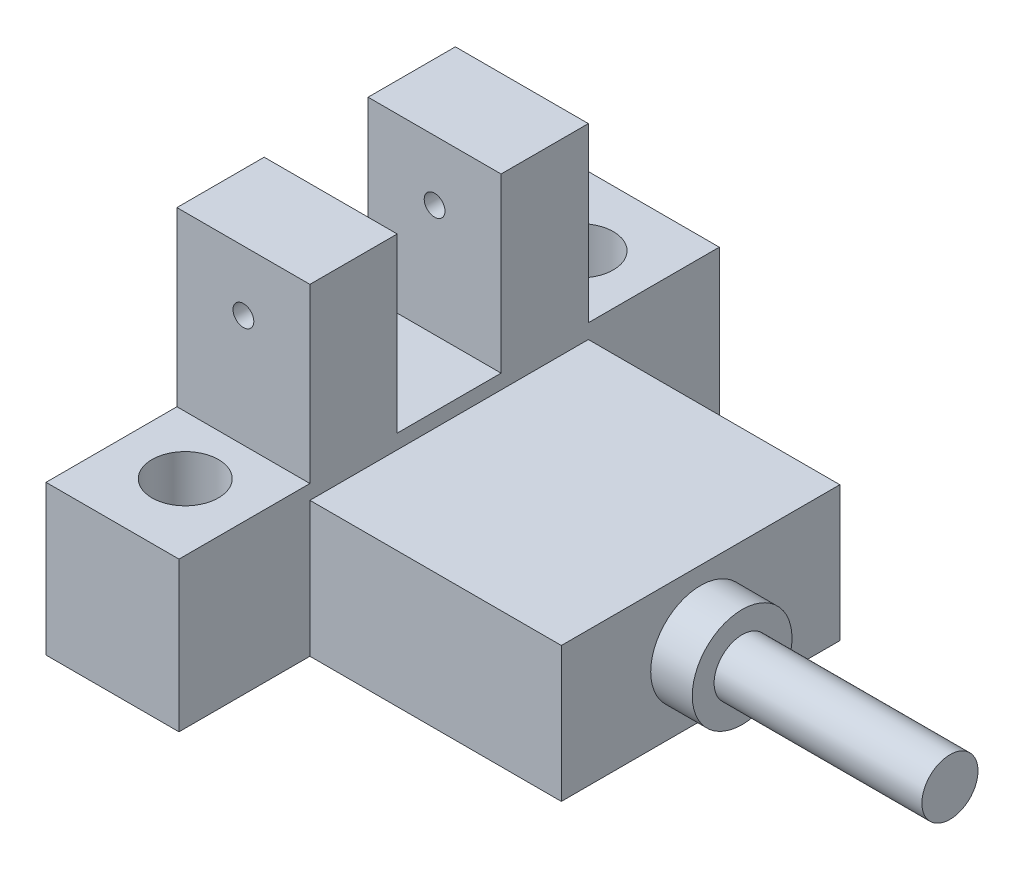
ISO-10303-21;
HEADER;
FILE_DESCRIPTION(('STEP AP214'),'2;1');
FILE_NAME('part.step','',(''),(''),'','','');
FILE_SCHEMA(('AUTOMOTIVE_DESIGN { 1 0 10303 214 1 1 1 1 }'));
ENDSEC;
DATA;
#1=APPLICATION_CONTEXT('core data for automotive mechanical design processes');
#2=APPLICATION_PROTOCOL_DEFINITION('international standard','automotive_design',2000,#1);
#3=PRODUCT_CONTEXT('',#1,'mechanical');
#4=PRODUCT('Part','Part','',(#3));
#5=PRODUCT_RELATED_PRODUCT_CATEGORY('part','',(#4));
#6=PRODUCT_DEFINITION_FORMATION('','',#4);
#7=PRODUCT_DEFINITION_CONTEXT('part definition',#1,'design');
#8=PRODUCT_DEFINITION('design','',#6,#7);
#9=PRODUCT_DEFINITION_SHAPE('','',#8);
#10=(LENGTH_UNIT() NAMED_UNIT(*) SI_UNIT(.MILLI.,.METRE.));
#11=(NAMED_UNIT(*) PLANE_ANGLE_UNIT() SI_UNIT($,.RADIAN.));
#12=(NAMED_UNIT(*) SI_UNIT($,.STERADIAN.) SOLID_ANGLE_UNIT());
#13=UNCERTAINTY_MEASURE_WITH_UNIT(LENGTH_MEASURE(1.E-05),#10,'distance_accuracy_value','');
#14=(GEOMETRIC_REPRESENTATION_CONTEXT(3) GLOBAL_UNCERTAINTY_ASSIGNED_CONTEXT((#13)) GLOBAL_UNIT_ASSIGNED_CONTEXT((#10,
#11,#12)) REPRESENTATION_CONTEXT('',''));
#15=CARTESIAN_POINT('',(0.,0.,0.));
#16=DIRECTION('',(0.,0.,1.));
#17=DIRECTION('',(1.,0.,0.));
#18=AXIS2_PLACEMENT_3D('',#15,#16,#17);
#19=CARTESIAN_POINT('',(20.5,3.24999999999999,13.));
#20=DIRECTION('',(1.,0.,0.));
#21=DIRECTION('',(0.,0.,-1.));
#22=AXIS2_PLACEMENT_3D('',#19,#20,#21);
#23=PLANE('',#22);
#24=CARTESIAN_POINT('',(20.5,3.24999999999999,13.));
#25=DIRECTION('',(1.,0.,0.));
#26=DIRECTION('',(0.,0.,-1.));
#27=AXIS2_PLACEMENT_3D('',#24,#25,#26);
#28=CIRCLE('',#27,2.4);
#29=CARTESIAN_POINT('',(20.5,3.24999999999999,10.6));
#30=VERTEX_POINT('',#29);
#31=EDGE_CURVE('E585',#30,#30,#28,.T.);
#32=ORIENTED_EDGE('',*,*,#31,.T.);
#33=EDGE_LOOP('',(#32));
#34=FACE_BOUND('',#33,.T.);
#35=CARTESIAN_POINT('',(20.5,3.24999999999999,13.));
#36=DIRECTION('',(1.,0.,0.));
#37=DIRECTION('',(0.,0.,-1.));
#38=AXIS2_PLACEMENT_3D('',#35,#36,#37);
#39=CIRCLE('',#38,1.35);
#40=CARTESIAN_POINT('',(20.5,3.24999999999999,11.65));
#41=VERTEX_POINT('',#40);
#42=EDGE_CURVE('E586',#41,#41,#39,.T.);
#43=ORIENTED_EDGE('',*,*,#42,.F.);
#44=EDGE_LOOP('',(#43));
#45=FACE_BOUND('',#44,.T.);
#46=ADVANCED_FACE('F38',(#34,#45),#23,.T.);
#47=CARTESIAN_POINT('',(18.5,6.5,26.));
#48=DIRECTION('',(-1.,0.,0.));
#49=DIRECTION('',(0.,0.,1.));
#50=AXIS2_PLACEMENT_3D('',#47,#48,#49);
#51=PLANE('',#50);
#52=DIRECTION('',(0.,0.,-1.));
#53=VECTOR('',#52,1.);
#54=CARTESIAN_POINT('',(18.5,0.,26.));
#55=LINE('',#54,#53);
#56=CARTESIAN_POINT('',(18.5,0.,19.7));
#57=VERTEX_POINT('',#56);
#58=CARTESIAN_POINT('',(18.5,0.,6.3));
#59=VERTEX_POINT('',#58);
#60=EDGE_CURVE('E46',#57,#59,#55,.T.);
#61=ORIENTED_EDGE('',*,*,#60,.T.);
#62=DIRECTION('',(0.,1.,0.));
#63=VECTOR('',#62,1.);
#64=CARTESIAN_POINT('',(18.5,-19.5,6.3));
#65=LINE('',#64,#63);
#66=CARTESIAN_POINT('',(18.5,6.5,6.3));
#67=VERTEX_POINT('',#66);
#68=EDGE_CURVE('E235',#59,#67,#65,.T.);
#69=ORIENTED_EDGE('',*,*,#68,.T.);
#70=DIRECTION('',(0.,0.,-1.));
#71=VECTOR('',#70,1.);
#72=CARTESIAN_POINT('',(18.5,6.5,26.));
#73=LINE('',#72,#71);
#74=CARTESIAN_POINT('',(18.5,6.5,19.7));
#75=VERTEX_POINT('',#74);
#76=EDGE_CURVE('E295',#75,#67,#73,.T.);
#77=ORIENTED_EDGE('',*,*,#76,.F.);
#78=DIRECTION('',(0.,1.,0.));
#79=VECTOR('',#78,1.);
#80=CARTESIAN_POINT('',(18.5,-19.5,19.7));
#81=LINE('',#80,#79);
#82=EDGE_CURVE('E251',#57,#75,#81,.T.);
#83=ORIENTED_EDGE('',*,*,#82,.F.);
#84=EDGE_LOOP('',(#61,#69,#77,#83));
#85=FACE_BOUND('',#84,.T.);
#86=CARTESIAN_POINT('',(18.5,3.24999999999999,13.));
#87=DIRECTION('',(-1.,0.,0.));
#88=DIRECTION('',(0.,0.,1.));
#89=AXIS2_PLACEMENT_3D('',#86,#87,#88);
#90=CIRCLE('',#89,2.4);
#91=CARTESIAN_POINT('',(18.5,3.24999999999999,15.4));
#92=VERTEX_POINT('',#91);
#93=EDGE_CURVE('E11',#92,#92,#90,.F.);
#94=ORIENTED_EDGE('',*,*,#93,.F.);
#95=EDGE_LOOP('',(#94));
#96=FACE_BOUND('',#95,.T.);
#97=ADVANCED_FACE('F341',(#85,#96),#51,.F.);
#98=CARTESIAN_POINT('',(0.,15.5,26.));
#99=DIRECTION('',(0.,-1.,0.));
#100=DIRECTION('',(0.,0.,-1.));
#101=AXIS2_PLACEMENT_3D('',#98,#99,#100);
#102=PLANE('',#101);
#103=DIRECTION('',(0.,0.,-1.));
#104=VECTOR('',#103,1.);
#105=CARTESIAN_POINT('',(6.4,15.5,26.));
#106=LINE('',#105,#104);
#107=CARTESIAN_POINT('',(6.4,15.5,19.7));
#108=VERTEX_POINT('',#107);
#109=CARTESIAN_POINT('',(6.4,15.5,15.5));
#110=VERTEX_POINT('',#109);
#111=EDGE_CURVE('E289',#108,#110,#106,.T.);
#112=ORIENTED_EDGE('',*,*,#111,.T.);
#113=DIRECTION('',(1.,0.,0.));
#114=VECTOR('',#113,1.);
#115=CARTESIAN_POINT('',(0.,15.5,15.5));
#116=LINE('',#115,#114);
#117=CARTESIAN_POINT('',(0.,15.5,15.5));
#118=VERTEX_POINT('',#117);
#119=EDGE_CURVE('E164',#118,#110,#116,.T.);
#120=ORIENTED_EDGE('',*,*,#119,.F.);
#121=DIRECTION('',(0.,0.,-1.));
#122=VECTOR('',#121,1.);
#123=CARTESIAN_POINT('',(0.,15.5,26.));
#124=LINE('',#123,#122);
#125=CARTESIAN_POINT('',(0.,15.5,19.7));
#126=VERTEX_POINT('',#125);
#127=EDGE_CURVE('E285',#126,#118,#124,.T.);
#128=ORIENTED_EDGE('',*,*,#127,.F.);
#129=DIRECTION('',(-1.,0.,0.));
#130=VECTOR('',#129,1.);
#131=CARTESIAN_POINT('',(0.,15.5,19.7));
#132=LINE('',#131,#130);
#133=EDGE_CURVE('E213',#108,#126,#132,.T.);
#134=ORIENTED_EDGE('',*,*,#133,.F.);
#135=EDGE_LOOP('',(#112,#120,#128,#134));
#136=FACE_BOUND('',#135,.T.);
#137=ADVANCED_FACE('F347',(#136),#102,.F.);
#138=CARTESIAN_POINT('',(0.,0.,0.));
#139=DIRECTION('',(0.,0.,-1.));
#140=DIRECTION('',(-1.,0.,0.));
#141=AXIS2_PLACEMENT_3D('',#138,#139,#140);
#142=PLANE('',#141);
#143=DIRECTION('',(0.,-1.,0.));
#144=VECTOR('',#143,1.);
#145=CARTESIAN_POINT('',(0.,0.,0.));
#146=LINE('',#145,#144);
#147=CARTESIAN_POINT('',(0.,7.2,0.));
#148=VERTEX_POINT('',#147);
#149=CARTESIAN_POINT('',(0.,0.,0.));
#150=VERTEX_POINT('',#149);
#151=EDGE_CURVE('E266',#148,#150,#146,.T.);
#152=ORIENTED_EDGE('',*,*,#151,.F.);
#153=DIRECTION('',(-1.,0.,0.));
#154=VECTOR('',#153,1.);
#155=CARTESIAN_POINT('',(0.,7.2,0.));
#156=LINE('',#155,#154);
#157=CARTESIAN_POINT('',(6.4,7.2,0.));
#158=VERTEX_POINT('',#157);
#159=EDGE_CURVE('E203',#158,#148,#156,.T.);
#160=ORIENTED_EDGE('',*,*,#159,.F.);
#161=DIRECTION('',(0.,1.,0.));
#162=VECTOR('',#161,1.);
#163=CARTESIAN_POINT('',(6.4,15.5,0.));
#164=LINE('',#163,#162);
#165=CARTESIAN_POINT('',(6.4,0.,0.));
#166=VERTEX_POINT('',#165);
#167=EDGE_CURVE('E275',#166,#158,#164,.T.);
#168=ORIENTED_EDGE('',*,*,#167,.F.);
#169=DIRECTION('',(1.,0.,0.));
#170=VECTOR('',#169,1.);
#171=CARTESIAN_POINT('',(18.5,0.,0.));
#172=LINE('',#171,#170);
#173=EDGE_CURVE('E261',#150,#166,#172,.T.);
#174=ORIENTED_EDGE('',*,*,#173,.F.);
#175=EDGE_LOOP('',(#152,#160,#168,#174));
#176=FACE_BOUND('',#175,.T.);
#177=ADVANCED_FACE('F374',(#176),#142,.T.);
#178=CARTESIAN_POINT('',(18.5,0.,26.));
#179=DIRECTION('',(0.,1.,0.));
#180=DIRECTION('',(-1.,0.,0.));
#181=AXIS2_PLACEMENT_3D('',#178,#179,#180);
#182=PLANE('',#181);
#183=CARTESIAN_POINT('',(3.2,0.,3.5));
#184=DIRECTION('',(0.,1.,0.));
#185=DIRECTION('',(-1.,0.,0.));
#186=AXIS2_PLACEMENT_3D('',#183,#184,#185);
#187=CIRCLE('',#186,1.6);
#188=CARTESIAN_POINT('',(3.2,0.,5.1));
#189=VERTEX_POINT('',#188);
#190=EDGE_CURVE('E596',#189,#189,#187,.T.);
#191=ORIENTED_EDGE('',*,*,#190,.T.);
#192=EDGE_LOOP('',(#191));
#193=FACE_BOUND('',#192,.T.);
#194=CARTESIAN_POINT('',(3.2,0.,22.5));
#195=DIRECTION('',(0.,1.,0.));
#196=DIRECTION('',(-1.,0.,0.));
#197=AXIS2_PLACEMENT_3D('',#194,#195,#196);
#198=CIRCLE('',#197,1.6);
#199=CARTESIAN_POINT('',(3.2,0.,24.1));
#200=VERTEX_POINT('',#199);
#201=EDGE_CURVE('E310',#200,#200,#198,.T.);
#202=ORIENTED_EDGE('',*,*,#201,.T.);
#203=EDGE_LOOP('',(#202));
#204=FACE_BOUND('',#203,.T.);
#205=ORIENTED_EDGE('',*,*,#173,.T.);
#206=DIRECTION('',(0.,0.,1.));
#207=VECTOR('',#206,1.);
#208=CARTESIAN_POINT('',(6.4,0.,26.));
#209=LINE('',#208,#207);
#210=CARTESIAN_POINT('',(6.4,0.,6.3));
#211=VERTEX_POINT('',#210);
#212=EDGE_CURVE('E239',#166,#211,#209,.T.);
#213=ORIENTED_EDGE('',*,*,#212,.T.);
#214=DIRECTION('',(1.,0.,0.));
#215=VECTOR('',#214,1.);
#216=CARTESIAN_POINT('',(18.5,0.,6.3));
#217=LINE('',#216,#215);
#218=EDGE_CURVE('E245',#211,#59,#217,.T.);
#219=ORIENTED_EDGE('',*,*,#218,.T.);
#220=ORIENTED_EDGE('',*,*,#60,.F.);
#221=DIRECTION('',(-1.,0.,0.));
#222=VECTOR('',#221,1.);
#223=CARTESIAN_POINT('',(18.5,0.,19.7));
#224=LINE('',#223,#222);
#225=CARTESIAN_POINT('',(6.4,0.,19.7));
#226=VERTEX_POINT('',#225);
#227=EDGE_CURVE('E258',#57,#226,#224,.T.);
#228=ORIENTED_EDGE('',*,*,#227,.T.);
#229=DIRECTION('',(0.,0.,1.));
#230=VECTOR('',#229,1.);
#231=CARTESIAN_POINT('',(6.4,0.,26.));
#232=LINE('',#231,#230);
#233=CARTESIAN_POINT('',(6.4,0.,26.));
#234=VERTEX_POINT('',#233);
#235=EDGE_CURVE('E254',#226,#234,#232,.T.);
#236=ORIENTED_EDGE('',*,*,#235,.T.);
#237=DIRECTION('',(1.,0.,0.));
#238=VECTOR('',#237,1.);
#239=CARTESIAN_POINT('',(18.5,0.,26.));
#240=LINE('',#239,#238);
#241=CARTESIAN_POINT('',(0.,0.,26.));
#242=VERTEX_POINT('',#241);
#243=EDGE_CURVE('E262',#242,#234,#240,.T.);
#244=ORIENTED_EDGE('',*,*,#243,.F.);
#245=DIRECTION('',(0.,0.,-1.));
#246=VECTOR('',#245,1.);
#247=CARTESIAN_POINT('',(0.,0.,26.));
#248=LINE('',#247,#246);
#249=EDGE_CURVE('E271',#242,#150,#248,.T.);
#250=ORIENTED_EDGE('',*,*,#249,.T.);
#251=EDGE_LOOP('',(#205,#213,#219,#220,#228,#236,#244,#250));
#252=FACE_BOUND('',#251,.T.);
#253=ADVANCED_FACE('F40',(#193,#204,#252),#182,.F.);
#254=CARTESIAN_POINT('',(6.4,6.5,26.));
#255=DIRECTION('',(0.,-1.,0.));
#256=DIRECTION('',(1.,0.,0.));
#257=AXIS2_PLACEMENT_3D('',#254,#255,#256);
#258=PLANE('',#257);
#259=ORIENTED_EDGE('',*,*,#76,.T.);
#260=DIRECTION('',(1.,0.,0.));
#261=VECTOR('',#260,1.);
#262=CARTESIAN_POINT('',(6.4,6.5,6.3));
#263=LINE('',#262,#261);
#264=CARTESIAN_POINT('',(6.4,6.5,6.3));
#265=VERTEX_POINT('',#264);
#266=EDGE_CURVE('E230',#265,#67,#263,.T.);
#267=ORIENTED_EDGE('',*,*,#266,.F.);
#268=DIRECTION('',(0.,0.,-1.));
#269=VECTOR('',#268,1.);
#270=CARTESIAN_POINT('',(6.4,6.5,26.));
#271=LINE('',#270,#269);
#272=CARTESIAN_POINT('',(6.4,6.5,19.7));
#273=VERTEX_POINT('',#272);
#274=EDGE_CURVE('E291',#273,#265,#271,.T.);
#275=ORIENTED_EDGE('',*,*,#274,.F.);
#276=DIRECTION('',(-1.,0.,0.));
#277=VECTOR('',#276,1.);
#278=CARTESIAN_POINT('',(6.4,6.5,19.7));
#279=LINE('',#278,#277);
#280=EDGE_CURVE('E248',#75,#273,#279,.T.);
#281=ORIENTED_EDGE('',*,*,#280,.F.);
#282=EDGE_LOOP('',(#259,#267,#275,#281));
#283=FACE_BOUND('',#282,.T.);
#284=ADVANCED_FACE('F373',(#283),#258,.F.);
#285=CARTESIAN_POINT('',(6.4,15.5,26.));
#286=DIRECTION('',(-1.,0.,0.));
#287=DIRECTION('',(0.,-1.,0.));
#288=AXIS2_PLACEMENT_3D('',#285,#286,#287);
#289=PLANE('',#288);
#290=DIRECTION('',(0.,0.,-1.));
#291=VECTOR('',#290,1.);
#292=CARTESIAN_POINT('',(6.4,7.2,10.5));
#293=LINE('',#292,#291);
#294=CARTESIAN_POINT('',(6.4,7.2,15.5));
#295=VERTEX_POINT('',#294);
#296=CARTESIAN_POINT('',(6.4,7.2,10.5));
#297=VERTEX_POINT('',#296);
#298=EDGE_CURVE('E169',#295,#297,#293,.T.);
#299=ORIENTED_EDGE('',*,*,#298,.F.);
#300=DIRECTION('',(0.,1.,0.));
#301=VECTOR('',#300,1.);
#302=CARTESIAN_POINT('',(6.4,-0.921576201698783,15.5));
#303=LINE('',#302,#301);
#304=EDGE_CURVE('E158',#295,#110,#303,.T.);
#305=ORIENTED_EDGE('',*,*,#304,.T.);
#306=ORIENTED_EDGE('',*,*,#111,.F.);
#307=DIRECTION('',(0.,1.,0.));
#308=VECTOR('',#307,1.);
#309=CARTESIAN_POINT('',(6.4,7.2,19.7));
#310=LINE('',#309,#308);
#311=CARTESIAN_POINT('',(6.4,7.2,19.7));
#312=VERTEX_POINT('',#311);
#313=EDGE_CURVE('E225',#312,#108,#310,.T.);
#314=ORIENTED_EDGE('',*,*,#313,.F.);
#315=DIRECTION('',(0.,0.,-1.));
#316=VECTOR('',#315,1.);
#317=CARTESIAN_POINT('',(6.4,7.2,26.));
#318=LINE('',#317,#316);
#319=CARTESIAN_POINT('',(6.4,7.2,26.));
#320=VERTEX_POINT('',#319);
#321=EDGE_CURVE('E220',#320,#312,#318,.T.);
#322=ORIENTED_EDGE('',*,*,#321,.F.);
#323=DIRECTION('',(0.,1.,0.));
#324=VECTOR('',#323,1.);
#325=CARTESIAN_POINT('',(6.4,15.5,26.));
#326=LINE('',#325,#324);
#327=EDGE_CURVE('E265',#234,#320,#326,.T.);
#328=ORIENTED_EDGE('',*,*,#327,.F.);
#329=ORIENTED_EDGE('',*,*,#235,.F.);
#330=DIRECTION('',(0.,1.,0.));
#331=VECTOR('',#330,1.);
#332=CARTESIAN_POINT('',(6.4,-19.5,19.7));
#333=LINE('',#332,#331);
#334=EDGE_CURVE('E252',#226,#273,#333,.T.);
#335=ORIENTED_EDGE('',*,*,#334,.T.);
#336=ORIENTED_EDGE('',*,*,#274,.T.);
#337=DIRECTION('',(0.,1.,0.));
#338=VECTOR('',#337,1.);
#339=CARTESIAN_POINT('',(6.4,-19.5,6.3));
#340=LINE('',#339,#338);
#341=EDGE_CURVE('E234',#211,#265,#340,.T.);
#342=ORIENTED_EDGE('',*,*,#341,.F.);
#343=ORIENTED_EDGE('',*,*,#212,.F.);
#344=ORIENTED_EDGE('',*,*,#167,.T.);
#345=DIRECTION('',(0.,0.,-1.));
#346=VECTOR('',#345,1.);
#347=CARTESIAN_POINT('',(6.4,7.2,0.));
#348=LINE('',#347,#346);
#349=CARTESIAN_POINT('',(6.4,7.2,6.3));
#350=VERTEX_POINT('',#349);
#351=EDGE_CURVE('E64',#350,#158,#348,.T.);
#352=ORIENTED_EDGE('',*,*,#351,.F.);
#353=DIRECTION('',(0.,1.,0.));
#354=VECTOR('',#353,1.);
#355=CARTESIAN_POINT('',(6.4,7.2,6.3));
#356=LINE('',#355,#354);
#357=CARTESIAN_POINT('',(6.4,15.5,6.3));
#358=VERTEX_POINT('',#357);
#359=EDGE_CURVE('E209',#350,#358,#356,.T.);
#360=ORIENTED_EDGE('',*,*,#359,.T.);
#361=CARTESIAN_POINT('',(6.4,15.5,10.5));
#362=VERTEX_POINT('',#361);
#363=EDGE_CURVE('E288',#362,#358,#106,.T.);
#364=ORIENTED_EDGE('',*,*,#363,.F.);
#365=DIRECTION('',(0.,1.,0.));
#366=VECTOR('',#365,1.);
#367=CARTESIAN_POINT('',(6.4,-0.921576201698783,10.5));
#368=LINE('',#367,#366);
#369=EDGE_CURVE('E182',#297,#362,#368,.T.);
#370=ORIENTED_EDGE('',*,*,#369,.F.);
#371=EDGE_LOOP('',(#299,#305,#306,#314,#322,#328,#329,#335,#336,#342,#343,#344,#352,#360,#364,#370));
#372=FACE_BOUND('',#371,.T.);
#373=ADVANCED_FACE('F180',(#372),#289,.F.);
#374=CARTESIAN_POINT('',(0.,15.5,10.5));
#375=VERTEX_POINT('',#374);
#376=CARTESIAN_POINT('',(0.,15.5,6.3));
#377=VERTEX_POINT('',#376);
#378=EDGE_CURVE('E284',#375,#377,#124,.T.);
#379=ORIENTED_EDGE('',*,*,#378,.F.);
#380=DIRECTION('',(-1.,0.,0.));
#381=VECTOR('',#380,1.);
#382=CARTESIAN_POINT('',(0.,15.5,10.5));
#383=LINE('',#382,#381);
#384=EDGE_CURVE('E53',#362,#375,#383,.T.);
#385=ORIENTED_EDGE('',*,*,#384,.F.);
#386=ORIENTED_EDGE('',*,*,#363,.T.);
#387=DIRECTION('',(1.,0.,0.));
#388=VECTOR('',#387,1.);
#389=CARTESIAN_POINT('',(0.,15.5,6.3));
#390=LINE('',#389,#388);
#391=EDGE_CURVE('E193',#377,#358,#390,.T.);
#392=ORIENTED_EDGE('',*,*,#391,.F.);
#393=EDGE_LOOP('',(#379,#385,#386,#392));
#394=FACE_BOUND('',#393,.T.);
#395=ADVANCED_FACE('F411',(#394),#102,.F.);
#396=CARTESIAN_POINT('',(0.,0.,26.));
#397=DIRECTION('',(1.,0.,0.));
#398=DIRECTION('',(0.,0.,-1.));
#399=AXIS2_PLACEMENT_3D('',#396,#397,#398);
#400=PLANE('',#399);
#401=ORIENTED_EDGE('',*,*,#127,.T.);
#402=DIRECTION('',(0.,1.,0.));
#403=VECTOR('',#402,1.);
#404=CARTESIAN_POINT('',(0.,-0.921576201698783,15.5));
#405=LINE('',#404,#403);
#406=CARTESIAN_POINT('',(0.,7.2,15.5));
#407=VERTEX_POINT('',#406);
#408=EDGE_CURVE('E191',#407,#118,#405,.T.);
#409=ORIENTED_EDGE('',*,*,#408,.F.);
#410=DIRECTION('',(0.,0.,1.));
#411=VECTOR('',#410,1.);
#412=CARTESIAN_POINT('',(0.,7.2,10.5));
#413=LINE('',#412,#411);
#414=CARTESIAN_POINT('',(0.,7.2,10.5));
#415=VERTEX_POINT('',#414);
#416=EDGE_CURVE('E177',#415,#407,#413,.T.);
#417=ORIENTED_EDGE('',*,*,#416,.F.);
#418=DIRECTION('',(0.,1.,0.));
#419=VECTOR('',#418,1.);
#420=CARTESIAN_POINT('',(0.,-0.921576201698783,10.5));
#421=LINE('',#420,#419);
#422=EDGE_CURVE('E189',#415,#375,#421,.T.);
#423=ORIENTED_EDGE('',*,*,#422,.T.);
#424=ORIENTED_EDGE('',*,*,#378,.T.);
#425=DIRECTION('',(0.,1.,0.));
#426=VECTOR('',#425,1.);
#427=CARTESIAN_POINT('',(0.,7.2,6.3));
#428=LINE('',#427,#426);
#429=CARTESIAN_POINT('',(0.,7.2,6.3));
#430=VERTEX_POINT('',#429);
#431=EDGE_CURVE('E206',#430,#377,#428,.T.);
#432=ORIENTED_EDGE('',*,*,#431,.F.);
#433=DIRECTION('',(0.,0.,1.));
#434=VECTOR('',#433,1.);
#435=CARTESIAN_POINT('',(0.,7.2,0.));
#436=LINE('',#435,#434);
#437=EDGE_CURVE('E194',#148,#430,#436,.T.);
#438=ORIENTED_EDGE('',*,*,#437,.F.);
#439=ORIENTED_EDGE('',*,*,#151,.T.);
#440=ORIENTED_EDGE('',*,*,#249,.F.);
#441=DIRECTION('',(0.,-1.,0.));
#442=VECTOR('',#441,1.);
#443=CARTESIAN_POINT('',(0.,0.,26.));
#444=LINE('',#443,#442);
#445=CARTESIAN_POINT('',(0.,7.2,26.));
#446=VERTEX_POINT('',#445);
#447=EDGE_CURVE('E269',#446,#242,#444,.T.);
#448=ORIENTED_EDGE('',*,*,#447,.F.);
#449=DIRECTION('',(0.,0.,1.));
#450=VECTOR('',#449,1.);
#451=CARTESIAN_POINT('',(0.,7.2,26.));
#452=LINE('',#451,#450);
#453=CARTESIAN_POINT('',(0.,7.2,19.7));
#454=VERTEX_POINT('',#453);
#455=EDGE_CURVE('E216',#454,#446,#452,.T.);
#456=ORIENTED_EDGE('',*,*,#455,.F.);
#457=DIRECTION('',(0.,1.,0.));
#458=VECTOR('',#457,1.);
#459=CARTESIAN_POINT('',(0.,7.2,19.7));
#460=LINE('',#459,#458);
#461=EDGE_CURVE('E227',#454,#126,#460,.T.);
#462=ORIENTED_EDGE('',*,*,#461,.T.);
#463=EDGE_LOOP('',(#401,#409,#417,#423,#424,#432,#438,#439,#440,#448,#456,#462));
#464=FACE_BOUND('',#463,.T.);
#465=ADVANCED_FACE('F404',(#464),#400,.F.);
#466=CARTESIAN_POINT('',(0.,0.,26.));
#467=DIRECTION('',(0.,0.,-1.));
#468=DIRECTION('',(-1.,0.,0.));
#469=AXIS2_PLACEMENT_3D('',#466,#467,#468);
#470=PLANE('',#469);
#471=ORIENTED_EDGE('',*,*,#327,.T.);
#472=DIRECTION('',(1.,0.,0.));
#473=VECTOR('',#472,1.);
#474=CARTESIAN_POINT('',(0.,7.2,26.));
#475=LINE('',#474,#473);
#476=EDGE_CURVE('E218',#446,#320,#475,.T.);
#477=ORIENTED_EDGE('',*,*,#476,.F.);
#478=ORIENTED_EDGE('',*,*,#447,.T.);
#479=ORIENTED_EDGE('',*,*,#243,.T.);
#480=EDGE_LOOP('',(#471,#477,#478,#479));
#481=FACE_BOUND('',#480,.T.);
#482=ADVANCED_FACE('F400',(#481),#470,.F.);
#483=CARTESIAN_POINT('',(6.4,-19.5,19.7));
#484=DIRECTION('',(0.,0.,-1.));
#485=DIRECTION('',(-1.,0.,0.));
#486=AXIS2_PLACEMENT_3D('',#483,#484,#485);
#487=PLANE('',#486);
#488=ORIENTED_EDGE('',*,*,#82,.T.);
#489=ORIENTED_EDGE('',*,*,#280,.T.);
#490=ORIENTED_EDGE('',*,*,#334,.F.);
#491=ORIENTED_EDGE('',*,*,#227,.F.);
#492=EDGE_LOOP('',(#488,#489,#490,#491));
#493=FACE_BOUND('',#492,.T.);
#494=ADVANCED_FACE('F395',(#493),#487,.F.);
#495=CARTESIAN_POINT('',(6.4,-19.5,6.3));
#496=DIRECTION('',(0.,0.,1.));
#497=DIRECTION('',(1.,0.,0.));
#498=AXIS2_PLACEMENT_3D('',#495,#496,#497);
#499=PLANE('',#498);
#500=ORIENTED_EDGE('',*,*,#341,.T.);
#501=ORIENTED_EDGE('',*,*,#266,.T.);
#502=ORIENTED_EDGE('',*,*,#68,.F.);
#503=ORIENTED_EDGE('',*,*,#218,.F.);
#504=EDGE_LOOP('',(#500,#501,#502,#503));
#505=FACE_BOUND('',#504,.T.);
#506=ADVANCED_FACE('F386',(#505),#499,.F.);
#507=CARTESIAN_POINT('',(0.,7.2,19.7));
#508=DIRECTION('',(0.,0.,-1.));
#509=DIRECTION('',(-1.,0.,0.));
#510=AXIS2_PLACEMENT_3D('',#507,#508,#509);
#511=PLANE('',#510);
#512=CARTESIAN_POINT('',(3.2,12.6,19.7));
#513=DIRECTION('',(0.,0.,1.));
#514=DIRECTION('',(1.,0.,0.));
#515=AXIS2_PLACEMENT_3D('',#512,#513,#514);
#516=CIRCLE('',#515,0.5);
#517=CARTESIAN_POINT('',(3.7,12.6,19.7));
#518=VERTEX_POINT('',#517);
#519=EDGE_CURVE('E303',#518,#518,#516,.T.);
#520=ORIENTED_EDGE('',*,*,#519,.F.);
#521=EDGE_LOOP('',(#520));
#522=FACE_BOUND('',#521,.T.);
#523=ORIENTED_EDGE('',*,*,#133,.T.);
#524=ORIENTED_EDGE('',*,*,#461,.F.);
#525=DIRECTION('',(-1.,0.,0.));
#526=VECTOR('',#525,1.);
#527=CARTESIAN_POINT('',(0.,7.2,19.7));
#528=LINE('',#527,#526);
#529=EDGE_CURVE('E222',#312,#454,#528,.T.);
#530=ORIENTED_EDGE('',*,*,#529,.F.);
#531=ORIENTED_EDGE('',*,*,#313,.T.);
#532=EDGE_LOOP('',(#523,#524,#530,#531));
#533=FACE_BOUND('',#532,.T.);
#534=ADVANCED_FACE('F417',(#522,#533),#511,.F.);
#535=CARTESIAN_POINT('',(0.,7.2,0.));
#536=DIRECTION('',(0.,-1.,0.));
#537=DIRECTION('',(0.,0.,-1.));
#538=AXIS2_PLACEMENT_3D('',#535,#536,#537);
#539=PLANE('',#538);
#540=CARTESIAN_POINT('',(3.2,7.2,22.5));
#541=DIRECTION('',(0.,1.,0.));
#542=DIRECTION('',(0.,0.,1.));
#543=AXIS2_PLACEMENT_3D('',#540,#541,#542);
#544=CIRCLE('',#543,1.6);
#545=CARTESIAN_POINT('',(3.2,7.2,24.1));
#546=VERTEX_POINT('',#545);
#547=EDGE_CURVE('E315',#546,#546,#544,.T.);
#548=ORIENTED_EDGE('',*,*,#547,.F.);
#549=EDGE_LOOP('',(#548));
#550=FACE_BOUND('',#549,.T.);
#551=ORIENTED_EDGE('',*,*,#455,.T.);
#552=ORIENTED_EDGE('',*,*,#476,.T.);
#553=ORIENTED_EDGE('',*,*,#321,.T.);
#554=ORIENTED_EDGE('',*,*,#529,.T.);
#555=EDGE_LOOP('',(#551,#552,#553,#554));
#556=FACE_BOUND('',#555,.T.);
#557=ADVANCED_FACE('F419',(#550,#556),#539,.F.);
#558=CARTESIAN_POINT('',(0.,7.2,6.3));
#559=DIRECTION('',(0.,0.,1.));
#560=DIRECTION('',(1.,0.,0.));
#561=AXIS2_PLACEMENT_3D('',#558,#559,#560);
#562=PLANE('',#561);
#563=CARTESIAN_POINT('',(3.2,12.6,6.3));
#564=DIRECTION('',(0.,0.,1.));
#565=DIRECTION('',(1.,0.,0.));
#566=AXIS2_PLACEMENT_3D('',#563,#564,#565);
#567=CIRCLE('',#566,0.5);
#568=CARTESIAN_POINT('',(3.7,12.6,6.3));
#569=VERTEX_POINT('',#568);
#570=EDGE_CURVE('E307',#569,#569,#567,.T.);
#571=ORIENTED_EDGE('',*,*,#570,.T.);
#572=EDGE_LOOP('',(#571));
#573=FACE_BOUND('',#572,.T.);
#574=ORIENTED_EDGE('',*,*,#391,.T.);
#575=ORIENTED_EDGE('',*,*,#359,.F.);
#576=DIRECTION('',(1.,0.,0.));
#577=VECTOR('',#576,1.);
#578=CARTESIAN_POINT('',(0.,7.2,6.3));
#579=LINE('',#578,#577);
#580=EDGE_CURVE('E198',#430,#350,#579,.T.);
#581=ORIENTED_EDGE('',*,*,#580,.F.);
#582=ORIENTED_EDGE('',*,*,#431,.T.);
#583=EDGE_LOOP('',(#574,#575,#581,#582));
#584=FACE_BOUND('',#583,.T.);
#585=ADVANCED_FACE('F324',(#573,#584),#562,.F.);
#586=CARTESIAN_POINT('',(0.,7.2,0.));
#587=DIRECTION('',(0.,1.,0.));
#588=DIRECTION('',(0.,0.,1.));
#589=AXIS2_PLACEMENT_3D('',#586,#587,#588);
#590=PLANE('',#589);
#591=CARTESIAN_POINT('',(3.2,7.2,3.5));
#592=DIRECTION('',(0.,1.,0.));
#593=DIRECTION('',(0.,0.,1.));
#594=AXIS2_PLACEMENT_3D('',#591,#592,#593);
#595=CIRCLE('',#594,1.6);
#596=CARTESIAN_POINT('',(3.2,7.2,5.1));
#597=VERTEX_POINT('',#596);
#598=EDGE_CURVE('E588',#597,#597,#595,.T.);
#599=ORIENTED_EDGE('',*,*,#598,.F.);
#600=EDGE_LOOP('',(#599));
#601=FACE_BOUND('',#600,.T.);
#602=ORIENTED_EDGE('',*,*,#437,.T.);
#603=ORIENTED_EDGE('',*,*,#580,.T.);
#604=ORIENTED_EDGE('',*,*,#351,.T.);
#605=ORIENTED_EDGE('',*,*,#159,.T.);
#606=EDGE_LOOP('',(#602,#603,#604,#605));
#607=FACE_BOUND('',#606,.T.);
#608=ADVANCED_FACE('F407',(#601,#607),#590,.T.);
#609=CARTESIAN_POINT('',(0.,7.2,0.));
#610=DIRECTION('',(0.,-1.,0.));
#611=DIRECTION('',(0.,0.,-1.));
#612=AXIS2_PLACEMENT_3D('',#609,#610,#611);
#613=PLANE('',#612);
#614=ORIENTED_EDGE('',*,*,#416,.T.);
#615=DIRECTION('',(1.,0.,0.));
#616=VECTOR('',#615,1.);
#617=CARTESIAN_POINT('',(0.,7.2,15.5));
#618=LINE('',#617,#616);
#619=EDGE_CURVE('E161',#407,#295,#618,.T.);
#620=ORIENTED_EDGE('',*,*,#619,.T.);
#621=ORIENTED_EDGE('',*,*,#298,.T.);
#622=DIRECTION('',(-1.,0.,0.));
#623=VECTOR('',#622,1.);
#624=CARTESIAN_POINT('',(0.,7.2,10.5));
#625=LINE('',#624,#623);
#626=EDGE_CURVE('E184',#297,#415,#625,.T.);
#627=ORIENTED_EDGE('',*,*,#626,.T.);
#628=EDGE_LOOP('',(#614,#620,#621,#627));
#629=FACE_BOUND('',#628,.T.);
#630=ADVANCED_FACE('F173',(#629),#613,.F.);
#631=CARTESIAN_POINT('',(0.,-0.921576201698783,15.5));
#632=DIRECTION('',(0.,0.,1.));
#633=DIRECTION('',(1.,0.,0.));
#634=AXIS2_PLACEMENT_3D('',#631,#632,#633);
#635=PLANE('',#634);
#636=CARTESIAN_POINT('',(3.2,12.6,15.5));
#637=DIRECTION('',(0.,0.,1.));
#638=DIRECTION('',(1.,0.,0.));
#639=AXIS2_PLACEMENT_3D('',#636,#637,#638);
#640=CIRCLE('',#639,0.5);
#641=CARTESIAN_POINT('',(3.7,12.6,15.5));
#642=VERTEX_POINT('',#641);
#643=EDGE_CURVE('E302',#642,#642,#640,.T.);
#644=ORIENTED_EDGE('',*,*,#643,.T.);
#645=EDGE_LOOP('',(#644));
#646=FACE_BOUND('',#645,.T.);
#647=ORIENTED_EDGE('',*,*,#408,.T.);
#648=ORIENTED_EDGE('',*,*,#119,.T.);
#649=ORIENTED_EDGE('',*,*,#304,.F.);
#650=ORIENTED_EDGE('',*,*,#619,.F.);
#651=EDGE_LOOP('',(#647,#648,#649,#650));
#652=FACE_BOUND('',#651,.T.);
#653=ADVANCED_FACE('F160',(#646,#652),#635,.F.);
#654=CARTESIAN_POINT('',(0.,-0.921576201698783,10.5));
#655=DIRECTION('',(0.,0.,-1.));
#656=DIRECTION('',(-1.,0.,0.));
#657=AXIS2_PLACEMENT_3D('',#654,#655,#656);
#658=PLANE('',#657);
#659=CARTESIAN_POINT('',(3.2,12.6,10.5));
#660=DIRECTION('',(0.,0.,-1.));
#661=DIRECTION('',(-1.,0.,0.));
#662=AXIS2_PLACEMENT_3D('',#659,#660,#661);
#663=CIRCLE('',#662,0.5);
#664=CARTESIAN_POINT('',(2.7,12.6,10.5));
#665=VERTEX_POINT('',#664);
#666=EDGE_CURVE('E300',#665,#665,#663,.T.);
#667=ORIENTED_EDGE('',*,*,#666,.T.);
#668=EDGE_LOOP('',(#667));
#669=FACE_BOUND('',#668,.T.);
#670=ORIENTED_EDGE('',*,*,#369,.T.);
#671=ORIENTED_EDGE('',*,*,#384,.T.);
#672=ORIENTED_EDGE('',*,*,#422,.F.);
#673=ORIENTED_EDGE('',*,*,#626,.F.);
#674=EDGE_LOOP('',(#670,#671,#672,#673));
#675=FACE_BOUND('',#674,.T.);
#676=ADVANCED_FACE('F330',(#669,#675),#658,.F.);
#677=CARTESIAN_POINT('',(3.2,12.6,0.));
#678=DIRECTION('',(0.,0.,1.));
#679=DIRECTION('',(1.,0.,0.));
#680=AXIS2_PLACEMENT_3D('',#677,#678,#679);
#681=CYLINDRICAL_SURFACE('',#680,0.5);
#682=ORIENTED_EDGE('',*,*,#666,.F.);
#683=EDGE_LOOP('',(#682));
#684=FACE_BOUND('',#683,.T.);
#685=ORIENTED_EDGE('',*,*,#570,.F.);
#686=EDGE_LOOP('',(#685));
#687=FACE_BOUND('',#686,.T.);
#688=ADVANCED_FACE('F327',(#684,#687),#681,.F.);
#689=ORIENTED_EDGE('',*,*,#519,.T.);
#690=EDGE_LOOP('',(#689));
#691=FACE_BOUND('',#690,.T.);
#692=ORIENTED_EDGE('',*,*,#643,.F.);
#693=EDGE_LOOP('',(#692));
#694=FACE_BOUND('',#693,.T.);
#695=ADVANCED_FACE('F329',(#691,#694),#681,.F.);
#696=CARTESIAN_POINT('',(3.2,-1.1,22.5));
#697=DIRECTION('',(0.,1.,0.));
#698=DIRECTION('',(0.,0.,1.));
#699=AXIS2_PLACEMENT_3D('',#696,#697,#698);
#700=CYLINDRICAL_SURFACE('',#699,1.6);
#701=CARTESIAN_POINT('',(3.2,7.2,24.1));
#702=CARTESIAN_POINT('',(3.2,7.125,24.1));
#703=CARTESIAN_POINT('',(3.2,7.05,24.1));
#704=CARTESIAN_POINT('',(3.2,6.9,24.1));
#705=CARTESIAN_POINT('',(3.2,6.825,24.1));
#706=CARTESIAN_POINT('',(3.2,6.675,24.1));
#707=CARTESIAN_POINT('',(3.2,6.6,24.1));
#708=CARTESIAN_POINT('',(3.2,6.45,24.1));
#709=CARTESIAN_POINT('',(3.2,6.375,24.1));
#710=CARTESIAN_POINT('',(3.2,6.225,24.1));
#711=CARTESIAN_POINT('',(3.2,6.15,24.1));
#712=CARTESIAN_POINT('',(3.2,6.,24.1));
#713=CARTESIAN_POINT('',(3.2,5.925,24.1));
#714=CARTESIAN_POINT('',(3.2,5.775,24.1));
#715=CARTESIAN_POINT('',(3.2,5.7,24.1));
#716=CARTESIAN_POINT('',(3.2,5.55,24.1));
#717=CARTESIAN_POINT('',(3.2,5.475,24.1));
#718=CARTESIAN_POINT('',(3.2,5.325,24.1));
#719=CARTESIAN_POINT('',(3.2,5.25,24.1));
#720=CARTESIAN_POINT('',(3.2,5.1,24.1));
#721=CARTESIAN_POINT('',(3.2,5.025,24.1));
#722=CARTESIAN_POINT('',(3.2,4.875,24.1));
#723=CARTESIAN_POINT('',(3.2,4.8,24.1));
#724=CARTESIAN_POINT('',(3.2,4.65,24.1));
#725=CARTESIAN_POINT('',(3.2,4.575,24.1));
#726=CARTESIAN_POINT('',(3.2,4.425,24.1));
#727=CARTESIAN_POINT('',(3.2,4.35,24.1));
#728=CARTESIAN_POINT('',(3.2,4.2,24.1));
#729=CARTESIAN_POINT('',(3.2,4.125,24.1));
#730=CARTESIAN_POINT('',(3.2,3.975,24.1));
#731=CARTESIAN_POINT('',(3.2,3.9,24.1));
#732=CARTESIAN_POINT('',(3.2,3.75,24.1));
#733=CARTESIAN_POINT('',(3.2,3.675,24.1));
#734=CARTESIAN_POINT('',(3.2,3.525,24.1));
#735=CARTESIAN_POINT('',(3.2,3.45,24.1));
#736=CARTESIAN_POINT('',(3.2,3.3,24.1));
#737=CARTESIAN_POINT('',(3.2,3.225,24.1));
#738=CARTESIAN_POINT('',(3.2,3.075,24.1));
#739=CARTESIAN_POINT('',(3.2,3.,24.1));
#740=CARTESIAN_POINT('',(3.2,2.85,24.1));
#741=CARTESIAN_POINT('',(3.2,2.775,24.1));
#742=CARTESIAN_POINT('',(3.2,2.625,24.1));
#743=CARTESIAN_POINT('',(3.2,2.55,24.1));
#744=CARTESIAN_POINT('',(3.2,2.4,24.1));
#745=CARTESIAN_POINT('',(3.2,2.325,24.1));
#746=CARTESIAN_POINT('',(3.2,2.175,24.1));
#747=CARTESIAN_POINT('',(3.2,2.1,24.1));
#748=CARTESIAN_POINT('',(3.2,1.95,24.1));
#749=CARTESIAN_POINT('',(3.2,1.875,24.1));
#750=CARTESIAN_POINT('',(3.2,1.725,24.1));
#751=CARTESIAN_POINT('',(3.2,1.65,24.1));
#752=CARTESIAN_POINT('',(3.2,1.5,24.1));
#753=CARTESIAN_POINT('',(3.2,1.425,24.1));
#754=CARTESIAN_POINT('',(3.2,1.275,24.1));
#755=CARTESIAN_POINT('',(3.2,1.2,24.1));
#756=CARTESIAN_POINT('',(3.2,1.05,24.1));
#757=CARTESIAN_POINT('',(3.2,0.974999999999999,24.1));
#758=CARTESIAN_POINT('',(3.2,0.825,24.1));
#759=CARTESIAN_POINT('',(3.2,0.75,24.1));
#760=CARTESIAN_POINT('',(3.2,0.6,24.1));
#761=CARTESIAN_POINT('',(3.2,0.525,24.1));
#762=CARTESIAN_POINT('',(3.2,0.375,24.1));
#763=CARTESIAN_POINT('',(3.2,0.3,24.1));
#764=CARTESIAN_POINT('',(3.2,0.15,24.1));
#765=CARTESIAN_POINT('',(3.2,0.0749999999999999,24.1));
#766=CARTESIAN_POINT('',(3.2,0.,24.1));
#767=B_SPLINE_CURVE_WITH_KNOTS('',3,(#701,#702,#703,#704,#705,#706,#707,#708,#709,#710,#711,
#712,#713,#714,#715,#716,#717,#718,#719,#720,#721,#722,#723,#724,#725,#726,#727,#728,#729,#730,
#731,#732,#733,#734,#735,#736,#737,#738,#739,#740,#741,#742,#743,#744,#745,#746,#747,#748,#749,
#750,#751,#752,#753,#754,#755,#756,#757,#758,#759,#760,#761,#762,#763,#764,#765,#766),
.UNSPECIFIED.,.F.,.F.,(4,2,2,2,2,2,2,2,2,2,2,2,2,2,2,2,2,2,2,2,2,2,2,2,2,2,2,2,2,2,2,2,4),(0.,
0.225,0.450000000000001,0.674999999999999,0.899999999999999,1.125,1.35,1.575,1.8,2.025,2.25,
2.475,2.7,2.925,3.15,3.375,3.6,3.825,4.05,4.275,4.5,4.725,4.95,5.175,5.4,5.625,5.85,6.075,6.3,
6.525,6.75,6.975,7.2),.UNSPECIFIED.);
#768=EDGE_CURVE('BSEAM337',#546,#200,#767,.T.);
#769=ORIENTED_EDGE('',*,*,#547,.T.);
#770=ORIENTED_EDGE('',*,*,#201,.F.);
#771=ORIENTED_EDGE('',*,*,#768,.T.);
#772=ORIENTED_EDGE('',*,*,#768,.F.);
#773=EDGE_LOOP('',(#769,#771,#770,#772));
#774=FACE_BOUND('',#773,.T.);
#775=ADVANCED_FACE('F337',(#774),#700,.F.);
#776=CARTESIAN_POINT('',(3.2,-1.1,3.5));
#777=DIRECTION('',(0.,1.,0.));
#778=DIRECTION('',(0.,0.,1.));
#779=AXIS2_PLACEMENT_3D('',#776,#777,#778);
#780=CYLINDRICAL_SURFACE('',#779,1.6);
#781=CARTESIAN_POINT('',(3.2,7.2,5.1));
#782=CARTESIAN_POINT('',(3.2,7.125,5.1));
#783=CARTESIAN_POINT('',(3.2,7.05,5.1));
#784=CARTESIAN_POINT('',(3.2,6.9,5.1));
#785=CARTESIAN_POINT('',(3.2,6.825,5.1));
#786=CARTESIAN_POINT('',(3.2,6.675,5.1));
#787=CARTESIAN_POINT('',(3.2,6.6,5.1));
#788=CARTESIAN_POINT('',(3.2,6.45,5.1));
#789=CARTESIAN_POINT('',(3.2,6.375,5.1));
#790=CARTESIAN_POINT('',(3.2,6.225,5.1));
#791=CARTESIAN_POINT('',(3.2,6.15,5.1));
#792=CARTESIAN_POINT('',(3.2,6.,5.1));
#793=CARTESIAN_POINT('',(3.2,5.925,5.1));
#794=CARTESIAN_POINT('',(3.2,5.775,5.1));
#795=CARTESIAN_POINT('',(3.2,5.7,5.1));
#796=CARTESIAN_POINT('',(3.2,5.55,5.1));
#797=CARTESIAN_POINT('',(3.2,5.475,5.1));
#798=CARTESIAN_POINT('',(3.2,5.325,5.1));
#799=CARTESIAN_POINT('',(3.2,5.25,5.1));
#800=CARTESIAN_POINT('',(3.2,5.1,5.1));
#801=CARTESIAN_POINT('',(3.2,5.025,5.1));
#802=CARTESIAN_POINT('',(3.2,4.875,5.1));
#803=CARTESIAN_POINT('',(3.2,4.8,5.1));
#804=CARTESIAN_POINT('',(3.2,4.65,5.1));
#805=CARTESIAN_POINT('',(3.2,4.575,5.1));
#806=CARTESIAN_POINT('',(3.2,4.425,5.1));
#807=CARTESIAN_POINT('',(3.2,4.35,5.1));
#808=CARTESIAN_POINT('',(3.2,4.2,5.1));
#809=CARTESIAN_POINT('',(3.2,4.125,5.1));
#810=CARTESIAN_POINT('',(3.2,3.975,5.1));
#811=CARTESIAN_POINT('',(3.2,3.9,5.1));
#812=CARTESIAN_POINT('',(3.2,3.75,5.1));
#813=CARTESIAN_POINT('',(3.2,3.675,5.1));
#814=CARTESIAN_POINT('',(3.2,3.525,5.1));
#815=CARTESIAN_POINT('',(3.2,3.45,5.1));
#816=CARTESIAN_POINT('',(3.2,3.3,5.1));
#817=CARTESIAN_POINT('',(3.2,3.225,5.1));
#818=CARTESIAN_POINT('',(3.2,3.075,5.1));
#819=CARTESIAN_POINT('',(3.2,3.,5.1));
#820=CARTESIAN_POINT('',(3.2,2.85,5.1));
#821=CARTESIAN_POINT('',(3.2,2.775,5.1));
#822=CARTESIAN_POINT('',(3.2,2.625,5.1));
#823=CARTESIAN_POINT('',(3.2,2.55,5.1));
#824=CARTESIAN_POINT('',(3.2,2.4,5.1));
#825=CARTESIAN_POINT('',(3.2,2.325,5.1));
#826=CARTESIAN_POINT('',(3.2,2.175,5.1));
#827=CARTESIAN_POINT('',(3.2,2.1,5.1));
#828=CARTESIAN_POINT('',(3.2,1.95,5.1));
#829=CARTESIAN_POINT('',(3.2,1.875,5.1));
#830=CARTESIAN_POINT('',(3.2,1.725,5.1));
#831=CARTESIAN_POINT('',(3.2,1.65,5.1));
#832=CARTESIAN_POINT('',(3.2,1.5,5.1));
#833=CARTESIAN_POINT('',(3.2,1.425,5.1));
#834=CARTESIAN_POINT('',(3.2,1.275,5.1));
#835=CARTESIAN_POINT('',(3.2,1.2,5.1));
#836=CARTESIAN_POINT('',(3.2,1.05,5.1));
#837=CARTESIAN_POINT('',(3.2,0.974999999999999,5.1));
#838=CARTESIAN_POINT('',(3.2,0.825,5.1));
#839=CARTESIAN_POINT('',(3.2,0.75,5.1));
#840=CARTESIAN_POINT('',(3.2,0.6,5.1));
#841=CARTESIAN_POINT('',(3.2,0.525,5.1));
#842=CARTESIAN_POINT('',(3.2,0.375,5.1));
#843=CARTESIAN_POINT('',(3.2,0.3,5.1));
#844=CARTESIAN_POINT('',(3.2,0.15,5.1));
#845=CARTESIAN_POINT('',(3.2,0.0749999999999999,5.1));
#846=CARTESIAN_POINT('',(3.2,0.,5.1));
#847=B_SPLINE_CURVE_WITH_KNOTS('',3,(#781,#782,#783,#784,#785,#786,#787,#788,#789,#790,#791,
#792,#793,#794,#795,#796,#797,#798,#799,#800,#801,#802,#803,#804,#805,#806,#807,#808,#809,#810,
#811,#812,#813,#814,#815,#816,#817,#818,#819,#820,#821,#822,#823,#824,#825,#826,#827,#828,#829,
#830,#831,#832,#833,#834,#835,#836,#837,#838,#839,#840,#841,#842,#843,#844,#845,#846),
.UNSPECIFIED.,.F.,.F.,(4,2,2,2,2,2,2,2,2,2,2,2,2,2,2,2,2,2,2,2,2,2,2,2,2,2,2,2,2,2,2,2,4),(0.,
0.225,0.450000000000001,0.674999999999999,0.899999999999999,1.125,1.35,1.575,1.8,2.025,2.25,
2.475,2.7,2.925,3.15,3.375,3.6,3.825,4.05,4.275,4.5,4.725,4.95,5.175,5.4,5.625,5.85,6.075,6.3,
6.525,6.75,6.975,7.2),.UNSPECIFIED.);
#848=EDGE_CURVE('BSEAM358',#597,#189,#847,.T.);
#849=ORIENTED_EDGE('',*,*,#598,.T.);
#850=ORIENTED_EDGE('',*,*,#190,.F.);
#851=ORIENTED_EDGE('',*,*,#848,.T.);
#852=ORIENTED_EDGE('',*,*,#848,.F.);
#853=EDGE_LOOP('',(#849,#851,#850,#852));
#854=FACE_BOUND('',#853,.T.);
#855=ADVANCED_FACE('F358',(#854),#780,.F.);
#856=CARTESIAN_POINT('',(20.5,3.24999999999999,13.));
#857=DIRECTION('',(-1.,0.,0.));
#858=DIRECTION('',(0.,0.,1.));
#859=AXIS2_PLACEMENT_3D('',#856,#857,#858);
#860=CYLINDRICAL_SURFACE('',#859,2.4);
#861=ORIENTED_EDGE('',*,*,#31,.F.);
#862=EDGE_LOOP('',(#861));
#863=FACE_BOUND('',#862,.T.);
#864=ORIENTED_EDGE('',*,*,#93,.T.);
#865=EDGE_LOOP('',(#864));
#866=FACE_BOUND('',#865,.T.);
#867=ADVANCED_FACE('F355',(#863,#866),#860,.T.);
#868=CARTESIAN_POINT('',(30.5,3.24999999999999,13.));
#869=DIRECTION('',(-1.,0.,0.));
#870=DIRECTION('',(0.,0.,1.));
#871=AXIS2_PLACEMENT_3D('',#868,#869,#870);
#872=CYLINDRICAL_SURFACE('',#871,1.35);
#873=CARTESIAN_POINT('',(30.5,3.24999999999999,13.));
#874=DIRECTION('',(1.,0.,0.));
#875=DIRECTION('',(0.,0.,-1.));
#876=AXIS2_PLACEMENT_3D('',#873,#874,#875);
#877=CIRCLE('',#876,1.35);
#878=CARTESIAN_POINT('',(30.5,3.24999999999999,11.65));
#879=VERTEX_POINT('',#878);
#880=EDGE_CURVE('E584',#879,#879,#877,.T.);
#881=ORIENTED_EDGE('',*,*,#880,.F.);
#882=EDGE_LOOP('',(#881));
#883=FACE_BOUND('',#882,.T.);
#884=ORIENTED_EDGE('',*,*,#42,.T.);
#885=EDGE_LOOP('',(#884));
#886=FACE_BOUND('',#885,.T.);
#887=ADVANCED_FACE('F353',(#883,#886),#872,.T.);
#888=CARTESIAN_POINT('',(30.5,3.24999999999999,13.));
#889=DIRECTION('',(1.,0.,0.));
#890=DIRECTION('',(0.,0.,-1.));
#891=AXIS2_PLACEMENT_3D('',#888,#889,#890);
#892=PLANE('',#891);
#893=ORIENTED_EDGE('',*,*,#880,.T.);
#894=EDGE_LOOP('',(#893));
#895=FACE_BOUND('',#894,.T.);
#896=ADVANCED_FACE('F570',(#895),#892,.T.);
#897=CLOSED_SHELL('',(#46,#97,#137,#177,#253,#284,#373,#395,#465,#482,#494,#506,#534,#557,#585,
#608,#630,#653,#676,#688,#695,#775,#855,#867,#887,#896));
#898=MANIFOLD_SOLID_BREP('B2',#897);
#899=ADVANCED_BREP_SHAPE_REPRESENTATION('',(#18,#898),#14);
#900=SHAPE_DEFINITION_REPRESENTATION(#9,#899);
ENDSEC;
END-ISO-10303-21;
